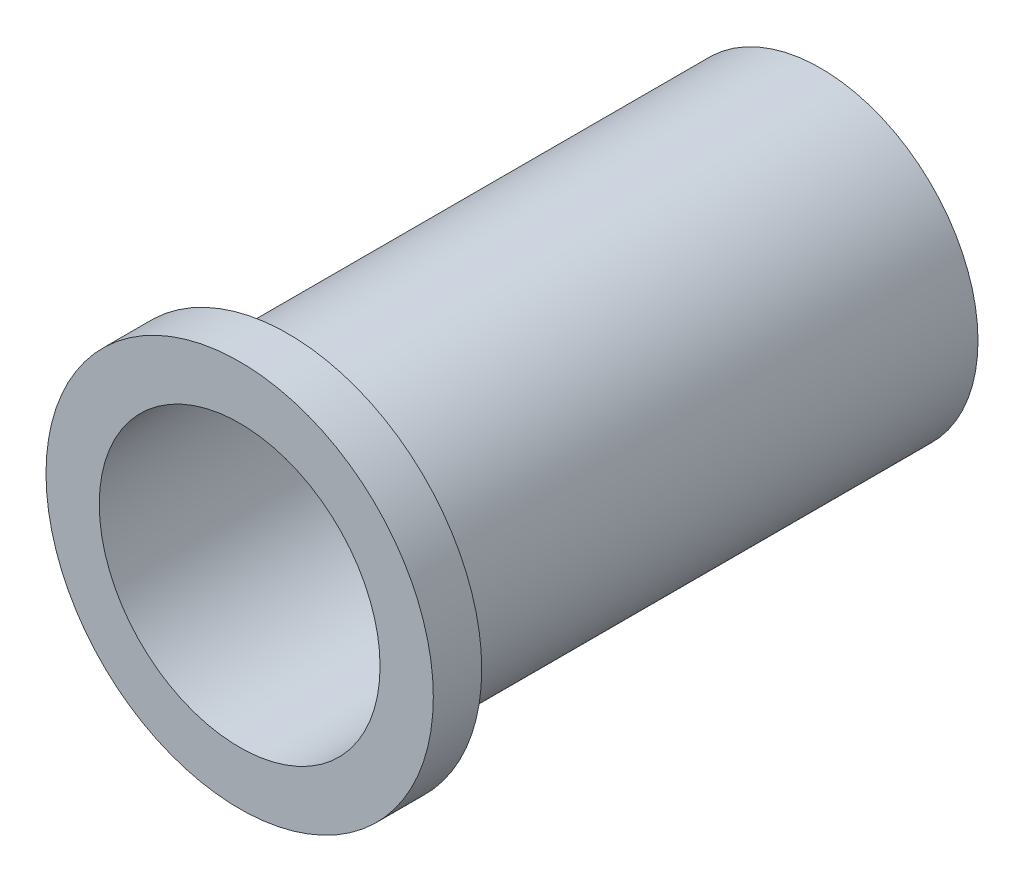
ISO-10303-21;
HEADER;
FILE_DESCRIPTION(('STEP AP214'),'2;1');
FILE_NAME('part.step','',(''),(''),'','','');
FILE_SCHEMA(('AUTOMOTIVE_DESIGN { 1 0 10303 214 1 1 1 1 }'));
ENDSEC;
DATA;
#1=APPLICATION_CONTEXT('core data for automotive mechanical design processes');
#2=APPLICATION_PROTOCOL_DEFINITION('international standard','automotive_design',2000,#1);
#3=PRODUCT_CONTEXT('',#1,'mechanical');
#4=PRODUCT('Part','Part','',(#3));
#5=PRODUCT_RELATED_PRODUCT_CATEGORY('part','',(#4));
#6=PRODUCT_DEFINITION_FORMATION('','',#4);
#7=PRODUCT_DEFINITION_CONTEXT('part definition',#1,'design');
#8=PRODUCT_DEFINITION('design','',#6,#7);
#9=PRODUCT_DEFINITION_SHAPE('','',#8);
#10=(LENGTH_UNIT() NAMED_UNIT(*) SI_UNIT(.MILLI.,.METRE.));
#11=(NAMED_UNIT(*) PLANE_ANGLE_UNIT() SI_UNIT($,.RADIAN.));
#12=(NAMED_UNIT(*) SI_UNIT($,.STERADIAN.) SOLID_ANGLE_UNIT());
#13=UNCERTAINTY_MEASURE_WITH_UNIT(LENGTH_MEASURE(1.E-05),#10,'distance_accuracy_value','');
#14=(GEOMETRIC_REPRESENTATION_CONTEXT(3) GLOBAL_UNCERTAINTY_ASSIGNED_CONTEXT((#13)) GLOBAL_UNIT_ASSIGNED_CONTEXT((#10,
#11,#12)) REPRESENTATION_CONTEXT('',''));
#15=CARTESIAN_POINT('',(0.,0.,0.));
#16=DIRECTION('',(0.,0.,1.));
#17=DIRECTION('',(1.,0.,0.));
#18=AXIS2_PLACEMENT_3D('',#15,#16,#17);
#19=CARTESIAN_POINT('',(0.,0.,12.));
#20=DIRECTION('',(0.,0.,-1.));
#21=DIRECTION('',(-1.,0.,0.));
#22=AXIS2_PLACEMENT_3D('',#19,#20,#21);
#23=CYLINDRICAL_SURFACE('',#22,2.9);
#24=CARTESIAN_POINT('',(0.,0.,7.5));
#25=DIRECTION('',(0.,0.,-1.));
#26=DIRECTION('',(-1.,0.,0.));
#27=AXIS2_PLACEMENT_3D('',#24,#25,#26);
#28=CIRCLE('',#27,2.9);
#29=CARTESIAN_POINT('',(2.9,0.,7.5));
#30=VERTEX_POINT('',#29);
#31=EDGE_CURVE('E34',#30,#30,#28,.F.);
#32=ORIENTED_EDGE('',*,*,#31,.F.);
#33=EDGE_LOOP('',(#32));
#34=FACE_BOUND('',#33,.T.);
#35=CARTESIAN_POINT('',(0.,0.,12.));
#36=DIRECTION('',(0.,0.,-1.));
#37=DIRECTION('',(-1.,0.,0.));
#38=AXIS2_PLACEMENT_3D('',#35,#36,#37);
#39=CIRCLE('',#38,2.9);
#40=CARTESIAN_POINT('',(2.9,0.,12.));
#41=VERTEX_POINT('',#40);
#42=EDGE_CURVE('E19',#41,#41,#39,.T.);
#43=ORIENTED_EDGE('',*,*,#42,.F.);
#44=EDGE_LOOP('',(#43));
#45=FACE_BOUND('',#44,.T.);
#46=ADVANCED_FACE('F16',(#34,#45),#23,.F.);
#47=CARTESIAN_POINT('',(0.,0.,12.));
#48=DIRECTION('',(0.,0.,1.));
#49=DIRECTION('',(1.,0.,0.));
#50=AXIS2_PLACEMENT_3D('',#47,#48,#49);
#51=PLANE('',#50);
#52=ORIENTED_EDGE('',*,*,#42,.T.);
#53=EDGE_LOOP('',(#52));
#54=FACE_BOUND('',#53,.T.);
#55=CARTESIAN_POINT('',(0.,0.,12.));
#56=DIRECTION('',(0.,0.,-1.));
#57=DIRECTION('',(-1.,0.,0.));
#58=AXIS2_PLACEMENT_3D('',#55,#56,#57);
#59=CIRCLE('',#58,4.);
#60=CARTESIAN_POINT('',(4.,0.,12.));
#61=VERTEX_POINT('',#60);
#62=EDGE_CURVE('E69',#61,#61,#59,.T.);
#63=ORIENTED_EDGE('',*,*,#62,.F.);
#64=EDGE_LOOP('',(#63));
#65=FACE_BOUND('',#64,.T.);
#66=ADVANCED_FACE('F73',(#54,#65),#51,.T.);
#67=CARTESIAN_POINT('',(0.,0.,7.5));
#68=DIRECTION('',(0.,0.,1.));
#69=DIRECTION('',(1.,0.,0.));
#70=AXIS2_PLACEMENT_3D('',#67,#68,#69);
#71=PLANE('',#70);
#72=CARTESIAN_POINT('',(0.,0.,7.5));
#73=DIRECTION('',(0.,0.,1.));
#74=DIRECTION('',(1.,0.,0.));
#75=AXIS2_PLACEMENT_3D('',#72,#73,#74);
#76=CIRCLE('',#75,1.6);
#77=CARTESIAN_POINT('',(1.6,0.,7.5));
#78=VERTEX_POINT('',#77);
#79=EDGE_CURVE('E67',#78,#78,#76,.F.);
#80=ORIENTED_EDGE('',*,*,#79,.T.);
#81=EDGE_LOOP('',(#80));
#82=FACE_BOUND('',#81,.T.);
#83=ORIENTED_EDGE('',*,*,#31,.T.);
#84=EDGE_LOOP('',(#83));
#85=FACE_BOUND('',#84,.T.);
#86=ADVANCED_FACE('F76',(#82,#85),#71,.T.);
#87=CARTESIAN_POINT('',(0.,0.,12.));
#88=DIRECTION('',(0.,0.,-1.));
#89=DIRECTION('',(-1.,0.,0.));
#90=AXIS2_PLACEMENT_3D('',#87,#88,#89);
#91=CYLINDRICAL_SURFACE('',#90,4.);
#92=CARTESIAN_POINT('',(0.,0.,11.));
#93=DIRECTION('',(0.,0.,-1.));
#94=DIRECTION('',(-1.,0.,0.));
#95=AXIS2_PLACEMENT_3D('',#92,#93,#94);
#96=CIRCLE('',#95,4.);
#97=CARTESIAN_POINT('',(4.,0.,11.));
#98=VERTEX_POINT('',#97);
#99=EDGE_CURVE('E63',#98,#98,#96,.F.);
#100=ORIENTED_EDGE('',*,*,#99,.T.);
#101=EDGE_LOOP('',(#100));
#102=FACE_BOUND('',#101,.T.);
#103=ORIENTED_EDGE('',*,*,#62,.T.);
#104=EDGE_LOOP('',(#103));
#105=FACE_BOUND('',#104,.T.);
#106=ADVANCED_FACE('F78',(#102,#105),#91,.T.);
#107=CARTESIAN_POINT('',(0.,0.,0.));
#108=DIRECTION('',(0.,0.,1.));
#109=DIRECTION('',(1.,0.,0.));
#110=AXIS2_PLACEMENT_3D('',#107,#108,#109);
#111=CYLINDRICAL_SURFACE('',#110,1.6);
#112=CARTESIAN_POINT('',(0.,0.,0.));
#113=DIRECTION('',(0.,0.,1.));
#114=DIRECTION('',(1.,0.,0.));
#115=AXIS2_PLACEMENT_3D('',#112,#113,#114);
#116=CIRCLE('',#115,1.6);
#117=CARTESIAN_POINT('',(1.6,0.,0.));
#118=VERTEX_POINT('',#117);
#119=EDGE_CURVE('E61',#118,#118,#116,.F.);
#120=ORIENTED_EDGE('',*,*,#119,.T.);
#121=EDGE_LOOP('',(#120));
#122=FACE_BOUND('',#121,.T.);
#123=ORIENTED_EDGE('',*,*,#79,.F.);
#124=EDGE_LOOP('',(#123));
#125=FACE_BOUND('',#124,.T.);
#126=ADVANCED_FACE('F80',(#122,#125),#111,.F.);
#127=CARTESIAN_POINT('',(0.,0.,11.));
#128=DIRECTION('',(0.,0.,1.));
#129=DIRECTION('',(1.,0.,0.));
#130=AXIS2_PLACEMENT_3D('',#127,#128,#129);
#131=PLANE('',#130);
#132=CARTESIAN_POINT('',(0.,0.,11.));
#133=DIRECTION('',(0.,0.,1.));
#134=DIRECTION('',(1.,0.,0.));
#135=AXIS2_PLACEMENT_3D('',#132,#133,#134);
#136=CIRCLE('',#135,3.25);
#137=CARTESIAN_POINT('',(3.25,0.,11.));
#138=VERTEX_POINT('',#137);
#139=EDGE_CURVE('E24',#138,#138,#136,.F.);
#140=ORIENTED_EDGE('',*,*,#139,.F.);
#141=EDGE_LOOP('',(#140));
#142=FACE_BOUND('',#141,.T.);
#143=ORIENTED_EDGE('',*,*,#99,.F.);
#144=EDGE_LOOP('',(#143));
#145=FACE_BOUND('',#144,.T.);
#146=ADVANCED_FACE('F88',(#142,#145),#131,.F.);
#147=CARTESIAN_POINT('',(0.,0.,0.));
#148=DIRECTION('',(0.,0.,1.));
#149=DIRECTION('',(1.,0.,0.));
#150=AXIS2_PLACEMENT_3D('',#147,#148,#149);
#151=PLANE('',#150);
#152=ORIENTED_EDGE('',*,*,#119,.F.);
#153=EDGE_LOOP('',(#152));
#154=FACE_BOUND('',#153,.T.);
#155=CARTESIAN_POINT('',(0.,0.,0.));
#156=DIRECTION('',(0.,0.,1.));
#157=DIRECTION('',(1.,0.,0.));
#158=AXIS2_PLACEMENT_3D('',#155,#156,#157);
#159=CIRCLE('',#158,3.25);
#160=CARTESIAN_POINT('',(3.25,0.,0.));
#161=VERTEX_POINT('',#160);
#162=EDGE_CURVE('E11',#161,#161,#159,.T.);
#163=ORIENTED_EDGE('',*,*,#162,.F.);
#164=EDGE_LOOP('',(#163));
#165=FACE_BOUND('',#164,.T.);
#166=ADVANCED_FACE('F53',(#154,#165),#151,.F.);
#167=CARTESIAN_POINT('',(0.,0.,0.));
#168=DIRECTION('',(0.,0.,1.));
#169=DIRECTION('',(1.,0.,0.));
#170=AXIS2_PLACEMENT_3D('',#167,#168,#169);
#171=CYLINDRICAL_SURFACE('',#170,3.25);
#172=ORIENTED_EDGE('',*,*,#162,.T.);
#173=EDGE_LOOP('',(#172));
#174=FACE_BOUND('',#173,.T.);
#175=ORIENTED_EDGE('',*,*,#139,.T.);
#176=EDGE_LOOP('',(#175));
#177=FACE_BOUND('',#176,.T.);
#178=ADVANCED_FACE('F55',(#174,#177),#171,.T.);
#179=CLOSED_SHELL('',(#46,#66,#86,#106,#126,#146,#166,#178));
#180=MANIFOLD_SOLID_BREP('B1',#179);
#181=ADVANCED_BREP_SHAPE_REPRESENTATION('',(#18,#180),#14);
#182=SHAPE_DEFINITION_REPRESENTATION(#9,#181);
ENDSEC;
END-ISO-10303-21;
